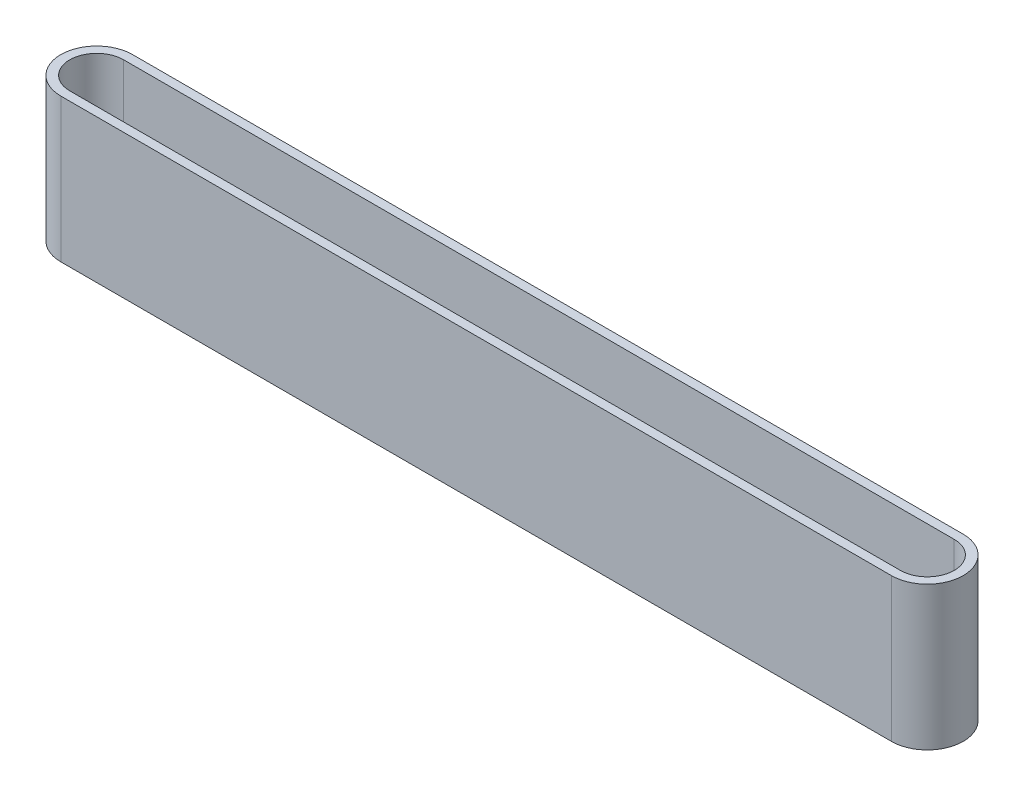
ISO-10303-21;
HEADER;
FILE_DESCRIPTION(('STEP AP214'),'2;1');
FILE_NAME('part.step','',(''),(''),'','','');
FILE_SCHEMA(('AUTOMOTIVE_DESIGN { 1 0 10303 214 1 1 1 1 }'));
ENDSEC;
DATA;
#1=APPLICATION_CONTEXT('core data for automotive mechanical design processes');
#2=APPLICATION_PROTOCOL_DEFINITION('international standard','automotive_design',2000,#1);
#3=PRODUCT_CONTEXT('',#1,'mechanical');
#4=PRODUCT('Part','Part','',(#3));
#5=PRODUCT_RELATED_PRODUCT_CATEGORY('part','',(#4));
#6=PRODUCT_DEFINITION_FORMATION('','',#4);
#7=PRODUCT_DEFINITION_CONTEXT('part definition',#1,'design');
#8=PRODUCT_DEFINITION('design','',#6,#7);
#9=PRODUCT_DEFINITION_SHAPE('','',#8);
#10=(LENGTH_UNIT() NAMED_UNIT(*) SI_UNIT(.MILLI.,.METRE.));
#11=(NAMED_UNIT(*) PLANE_ANGLE_UNIT() SI_UNIT($,.RADIAN.));
#12=(NAMED_UNIT(*) SI_UNIT($,.STERADIAN.) SOLID_ANGLE_UNIT());
#13=UNCERTAINTY_MEASURE_WITH_UNIT(LENGTH_MEASURE(1.E-05),#10,'distance_accuracy_value','');
#14=(GEOMETRIC_REPRESENTATION_CONTEXT(3) GLOBAL_UNCERTAINTY_ASSIGNED_CONTEXT((#13)) GLOBAL_UNIT_ASSIGNED_CONTEXT((#10,
#11,#12)) REPRESENTATION_CONTEXT('',''));
#15=CARTESIAN_POINT('',(0.,0.,0.));
#16=DIRECTION('',(0.,0.,1.));
#17=DIRECTION('',(1.,0.,0.));
#18=AXIS2_PLACEMENT_3D('',#15,#16,#17);
#19=CARTESIAN_POINT('',(-39.547680323748,16.,0.));
#20=DIRECTION('',(0.,1.,0.));
#21=DIRECTION('',(0.,0.,1.));
#22=AXIS2_PLACEMENT_3D('',#19,#20,#21);
#23=PLANE('',#22);
#24=CARTESIAN_POINT('',(-39.547680323748,16.,0.));
#25=DIRECTION('',(0.,1.,0.));
#26=DIRECTION('',(1.,0.,0.));
#27=AXIS2_PLACEMENT_3D('',#24,#25,#26);
#28=CIRCLE('',#27,3.99999999999999);
#29=CARTESIAN_POINT('',(-39.547680323748,16.,-3.99999999999999));
#30=VERTEX_POINT('',#29);
#31=CARTESIAN_POINT('',(-39.547680323748,16.,3.99999999999999));
#32=VERTEX_POINT('',#31);
#33=EDGE_CURVE('E158',#30,#32,#28,.T.);
#34=ORIENTED_EDGE('',*,*,#33,.T.);
#35=DIRECTION('',(1.,0.,0.));
#36=VECTOR('',#35,1.);
#37=CARTESIAN_POINT('',(-39.547680323748,16.,3.99999999999999));
#38=LINE('',#37,#36);
#39=CARTESIAN_POINT('',(53.002319676252,16.,4.));
#40=VERTEX_POINT('',#39);
#41=EDGE_CURVE('E161',#32,#40,#38,.T.);
#42=ORIENTED_EDGE('',*,*,#41,.T.);
#43=CARTESIAN_POINT('',(53.002319676252,16.,0.));
#44=DIRECTION('',(0.,1.,0.));
#45=DIRECTION('',(1.,0.,0.));
#46=AXIS2_PLACEMENT_3D('',#43,#44,#45);
#47=CIRCLE('',#46,4.);
#48=CARTESIAN_POINT('',(53.002319676252,16.,-4.));
#49=VERTEX_POINT('',#48);
#50=EDGE_CURVE('E164',#40,#49,#47,.T.);
#51=ORIENTED_EDGE('',*,*,#50,.T.);
#52=DIRECTION('',(-1.,0.,0.));
#53=VECTOR('',#52,1.);
#54=CARTESIAN_POINT('',(-39.547680323748,16.,-3.99999999999999));
#55=LINE('',#54,#53);
#56=EDGE_CURVE('E166',#49,#30,#55,.T.);
#57=ORIENTED_EDGE('',*,*,#56,.T.);
#58=EDGE_LOOP('',(#34,#42,#51,#57));
#59=FACE_BOUND('',#58,.T.);
#60=DIRECTION('',(1.,0.,0.));
#61=VECTOR('',#60,1.);
#62=CARTESIAN_POINT('',(-39.547680323748,16.,2.99999999999999));
#63=LINE('',#62,#61);
#64=CARTESIAN_POINT('',(-39.547680323748,16.,2.99999999999999));
#65=VERTEX_POINT('',#64);
#66=CARTESIAN_POINT('',(53.002319676252,16.,3.));
#67=VERTEX_POINT('',#66);
#68=EDGE_CURVE('E130',#65,#67,#63,.T.);
#69=ORIENTED_EDGE('',*,*,#68,.F.);
#70=CARTESIAN_POINT('',(-39.547680323748,16.,0.));
#71=DIRECTION('',(0.,1.,0.));
#72=DIRECTION('',(0.,0.,1.));
#73=AXIS2_PLACEMENT_3D('',#70,#71,#72);
#74=CIRCLE('',#73,2.99999999999999);
#75=CARTESIAN_POINT('',(-39.547680323748,16.,-2.99999999999999));
#76=VERTEX_POINT('',#75);
#77=EDGE_CURVE('E122',#76,#65,#74,.T.);
#78=ORIENTED_EDGE('',*,*,#77,.F.);
#79=DIRECTION('',(-1.,0.,0.));
#80=VECTOR('',#79,1.);
#81=CARTESIAN_POINT('',(-39.547680323748,16.,-2.99999999999999));
#82=LINE('',#81,#80);
#83=CARTESIAN_POINT('',(53.002319676252,16.,-3.));
#84=VERTEX_POINT('',#83);
#85=EDGE_CURVE('E144',#84,#76,#82,.T.);
#86=ORIENTED_EDGE('',*,*,#85,.F.);
#87=CARTESIAN_POINT('',(53.002319676252,16.,0.));
#88=DIRECTION('',(0.,1.,0.));
#89=DIRECTION('',(0.,0.,-1.));
#90=AXIS2_PLACEMENT_3D('',#87,#88,#89);
#91=CIRCLE('',#90,3.);
#92=EDGE_CURVE('E142',#67,#84,#91,.T.);
#93=ORIENTED_EDGE('',*,*,#92,.F.);
#94=EDGE_LOOP('',(#69,#78,#86,#93));
#95=FACE_BOUND('',#94,.T.);
#96=ADVANCED_FACE('F57',(#59,#95),#23,.T.);
#97=CARTESIAN_POINT('',(-39.547680323748,0.,0.));
#98=DIRECTION('',(0.,1.,0.));
#99=DIRECTION('',(0.,0.,1.));
#100=AXIS2_PLACEMENT_3D('',#97,#98,#99);
#101=PLANE('',#100);
#102=CARTESIAN_POINT('',(-39.547680323748,0.,0.));
#103=DIRECTION('',(0.,1.,0.));
#104=DIRECTION('',(1.,0.,0.));
#105=AXIS2_PLACEMENT_3D('',#102,#103,#104);
#106=CIRCLE('',#105,3.99999999999999);
#107=CARTESIAN_POINT('',(-39.547680323748,0.,-3.99999999999999));
#108=VERTEX_POINT('',#107);
#109=CARTESIAN_POINT('',(-39.547680323748,0.,3.99999999999999));
#110=VERTEX_POINT('',#109);
#111=EDGE_CURVE('E138',#108,#110,#106,.T.);
#112=ORIENTED_EDGE('',*,*,#111,.F.);
#113=DIRECTION('',(-1.,0.,0.));
#114=VECTOR('',#113,1.);
#115=CARTESIAN_POINT('',(-39.547680323748,0.,-3.99999999999999));
#116=LINE('',#115,#114);
#117=CARTESIAN_POINT('',(53.002319676252,0.,-4.));
#118=VERTEX_POINT('',#117);
#119=EDGE_CURVE('E162',#118,#108,#116,.T.);
#120=ORIENTED_EDGE('',*,*,#119,.F.);
#121=CARTESIAN_POINT('',(53.002319676252,0.,0.));
#122=DIRECTION('',(0.,1.,0.));
#123=DIRECTION('',(1.,0.,0.));
#124=AXIS2_PLACEMENT_3D('',#121,#122,#123);
#125=CIRCLE('',#124,4.);
#126=CARTESIAN_POINT('',(53.002319676252,0.,4.));
#127=VERTEX_POINT('',#126);
#128=EDGE_CURVE('E173',#127,#118,#125,.T.);
#129=ORIENTED_EDGE('',*,*,#128,.F.);
#130=DIRECTION('',(1.,0.,0.));
#131=VECTOR('',#130,1.);
#132=CARTESIAN_POINT('',(-39.547680323748,0.,3.99999999999999));
#133=LINE('',#132,#131);
#134=EDGE_CURVE('E171',#110,#127,#133,.T.);
#135=ORIENTED_EDGE('',*,*,#134,.F.);
#136=EDGE_LOOP('',(#112,#120,#129,#135));
#137=FACE_BOUND('',#136,.T.);
#138=CARTESIAN_POINT('',(-39.547680323748,0.,0.));
#139=DIRECTION('',(0.,1.,0.));
#140=DIRECTION('',(0.,0.,1.));
#141=AXIS2_PLACEMENT_3D('',#138,#139,#140);
#142=CIRCLE('',#141,2.99999999999999);
#143=CARTESIAN_POINT('',(-39.547680323748,0.,-2.99999999999999));
#144=VERTEX_POINT('',#143);
#145=CARTESIAN_POINT('',(-39.547680323748,0.,2.99999999999999));
#146=VERTEX_POINT('',#145);
#147=EDGE_CURVE('E80',#144,#146,#142,.T.);
#148=ORIENTED_EDGE('',*,*,#147,.T.);
#149=DIRECTION('',(1.,0.,0.));
#150=VECTOR('',#149,1.);
#151=CARTESIAN_POINT('',(-39.547680323748,0.,2.99999999999999));
#152=LINE('',#151,#150);
#153=CARTESIAN_POINT('',(53.002319676252,0.,3.));
#154=VERTEX_POINT('',#153);
#155=EDGE_CURVE('E137',#146,#154,#152,.T.);
#156=ORIENTED_EDGE('',*,*,#155,.T.);
#157=CARTESIAN_POINT('',(53.002319676252,0.,0.));
#158=DIRECTION('',(0.,1.,0.));
#159=DIRECTION('',(0.,0.,-1.));
#160=AXIS2_PLACEMENT_3D('',#157,#158,#159);
#161=CIRCLE('',#160,3.);
#162=CARTESIAN_POINT('',(53.002319676252,0.,-3.));
#163=VERTEX_POINT('',#162);
#164=EDGE_CURVE('E150',#154,#163,#161,.T.);
#165=ORIENTED_EDGE('',*,*,#164,.T.);
#166=DIRECTION('',(-1.,0.,0.));
#167=VECTOR('',#166,1.);
#168=CARTESIAN_POINT('',(-39.547680323748,0.,-2.99999999999999));
#169=LINE('',#168,#167);
#170=EDGE_CURVE('E131',#163,#144,#169,.T.);
#171=ORIENTED_EDGE('',*,*,#170,.T.);
#172=EDGE_LOOP('',(#148,#156,#165,#171));
#173=FACE_BOUND('',#172,.T.);
#174=ADVANCED_FACE('F191',(#137,#173),#101,.F.);
#175=CARTESIAN_POINT('',(-39.547680323748,16.,0.));
#176=DIRECTION('',(0.,-1.,0.));
#177=DIRECTION('',(0.,0.,-1.));
#178=AXIS2_PLACEMENT_3D('',#175,#176,#177);
#179=CYLINDRICAL_SURFACE('',#178,3.99999999999999);
#180=ORIENTED_EDGE('',*,*,#111,.T.);
#181=DIRECTION('',(0.,-1.,0.));
#182=VECTOR('',#181,1.);
#183=CARTESIAN_POINT('',(-39.547680323748,16.,3.99999999999999));
#184=LINE('',#183,#182);
#185=EDGE_CURVE('E12',#32,#110,#184,.T.);
#186=ORIENTED_EDGE('',*,*,#185,.F.);
#187=ORIENTED_EDGE('',*,*,#33,.F.);
#188=DIRECTION('',(0.,-1.,0.));
#189=VECTOR('',#188,1.);
#190=CARTESIAN_POINT('',(-39.547680323748,16.,-3.99999999999999));
#191=LINE('',#190,#189);
#192=EDGE_CURVE('E168',#30,#108,#191,.T.);
#193=ORIENTED_EDGE('',*,*,#192,.T.);
#194=EDGE_LOOP('',(#180,#186,#187,#193));
#195=FACE_BOUND('',#194,.T.);
#196=ADVANCED_FACE('F59',(#195),#179,.T.);
#197=CARTESIAN_POINT('',(-39.547680323748,16.,3.99999999999999));
#198=DIRECTION('',(0.,0.,-1.));
#199=DIRECTION('',(-1.,0.,0.));
#200=AXIS2_PLACEMENT_3D('',#197,#198,#199);
#201=PLANE('',#200);
#202=ORIENTED_EDGE('',*,*,#134,.T.);
#203=DIRECTION('',(0.,-1.,0.));
#204=VECTOR('',#203,1.);
#205=CARTESIAN_POINT('',(53.002319676252,16.,4.));
#206=LINE('',#205,#204);
#207=EDGE_CURVE('E65',#40,#127,#206,.T.);
#208=ORIENTED_EDGE('',*,*,#207,.F.);
#209=ORIENTED_EDGE('',*,*,#41,.F.);
#210=ORIENTED_EDGE('',*,*,#185,.T.);
#211=EDGE_LOOP('',(#202,#208,#209,#210));
#212=FACE_BOUND('',#211,.T.);
#213=ADVANCED_FACE('F201',(#212),#201,.F.);
#214=CARTESIAN_POINT('',(53.002319676252,16.,0.));
#215=DIRECTION('',(0.,-1.,0.));
#216=DIRECTION('',(0.,0.,-1.));
#217=AXIS2_PLACEMENT_3D('',#214,#215,#216);
#218=CYLINDRICAL_SURFACE('',#217,4.);
#219=ORIENTED_EDGE('',*,*,#128,.T.);
#220=DIRECTION('',(0.,-1.,0.));
#221=VECTOR('',#220,1.);
#222=CARTESIAN_POINT('',(53.002319676252,16.,-4.));
#223=LINE('',#222,#221);
#224=EDGE_CURVE('E178',#49,#118,#223,.T.);
#225=ORIENTED_EDGE('',*,*,#224,.F.);
#226=ORIENTED_EDGE('',*,*,#50,.F.);
#227=ORIENTED_EDGE('',*,*,#207,.T.);
#228=EDGE_LOOP('',(#219,#225,#226,#227));
#229=FACE_BOUND('',#228,.T.);
#230=ADVANCED_FACE('F185',(#229),#218,.T.);
#231=CARTESIAN_POINT('',(-39.547680323748,16.,-3.99999999999999));
#232=DIRECTION('',(0.,0.,1.));
#233=DIRECTION('',(1.,0.,0.));
#234=AXIS2_PLACEMENT_3D('',#231,#232,#233);
#235=PLANE('',#234);
#236=ORIENTED_EDGE('',*,*,#119,.T.);
#237=ORIENTED_EDGE('',*,*,#192,.F.);
#238=ORIENTED_EDGE('',*,*,#56,.F.);
#239=ORIENTED_EDGE('',*,*,#224,.T.);
#240=EDGE_LOOP('',(#236,#237,#238,#239));
#241=FACE_BOUND('',#240,.T.);
#242=ADVANCED_FACE('F195',(#241),#235,.F.);
#243=CARTESIAN_POINT('',(-39.547680323748,16.,0.));
#244=DIRECTION('',(0.,-1.,0.));
#245=DIRECTION('',(0.,0.,-1.));
#246=AXIS2_PLACEMENT_3D('',#243,#244,#245);
#247=CYLINDRICAL_SURFACE('',#246,2.99999999999999);
#248=ORIENTED_EDGE('',*,*,#147,.F.);
#249=DIRECTION('',(0.,-1.,0.));
#250=VECTOR('',#249,1.);
#251=CARTESIAN_POINT('',(-39.547680323748,16.,-2.99999999999999));
#252=LINE('',#251,#250);
#253=EDGE_CURVE('E126',#76,#144,#252,.T.);
#254=ORIENTED_EDGE('',*,*,#253,.F.);
#255=ORIENTED_EDGE('',*,*,#77,.T.);
#256=DIRECTION('',(0.,-1.,0.));
#257=VECTOR('',#256,1.);
#258=CARTESIAN_POINT('',(-39.547680323748,16.,2.99999999999999));
#259=LINE('',#258,#257);
#260=EDGE_CURVE('E125',#65,#146,#259,.T.);
#261=ORIENTED_EDGE('',*,*,#260,.T.);
#262=EDGE_LOOP('',(#248,#254,#255,#261));
#263=FACE_BOUND('',#262,.T.);
#264=ADVANCED_FACE('F124',(#263),#247,.F.);
#265=CARTESIAN_POINT('',(-39.547680323748,16.,2.99999999999999));
#266=DIRECTION('',(0.,0.,-1.));
#267=DIRECTION('',(-1.,0.,0.));
#268=AXIS2_PLACEMENT_3D('',#265,#266,#267);
#269=PLANE('',#268);
#270=ORIENTED_EDGE('',*,*,#155,.F.);
#271=ORIENTED_EDGE('',*,*,#260,.F.);
#272=ORIENTED_EDGE('',*,*,#68,.T.);
#273=DIRECTION('',(0.,-1.,0.));
#274=VECTOR('',#273,1.);
#275=CARTESIAN_POINT('',(53.002319676252,16.,3.));
#276=LINE('',#275,#274);
#277=EDGE_CURVE('E139',#67,#154,#276,.T.);
#278=ORIENTED_EDGE('',*,*,#277,.T.);
#279=EDGE_LOOP('',(#270,#271,#272,#278));
#280=FACE_BOUND('',#279,.T.);
#281=ADVANCED_FACE('F134',(#280),#269,.T.);
#282=CARTESIAN_POINT('',(53.002319676252,16.,0.));
#283=DIRECTION('',(0.,-1.,0.));
#284=DIRECTION('',(0.,0.,-1.));
#285=AXIS2_PLACEMENT_3D('',#282,#283,#284);
#286=CYLINDRICAL_SURFACE('',#285,3.);
#287=ORIENTED_EDGE('',*,*,#164,.F.);
#288=ORIENTED_EDGE('',*,*,#277,.F.);
#289=ORIENTED_EDGE('',*,*,#92,.T.);
#290=DIRECTION('',(0.,-1.,0.));
#291=VECTOR('',#290,1.);
#292=CARTESIAN_POINT('',(53.002319676252,16.,-3.));
#293=LINE('',#292,#291);
#294=EDGE_CURVE('E72',#84,#163,#293,.T.);
#295=ORIENTED_EDGE('',*,*,#294,.T.);
#296=EDGE_LOOP('',(#287,#288,#289,#295));
#297=FACE_BOUND('',#296,.T.);
#298=ADVANCED_FACE('F224',(#297),#286,.F.);
#299=CARTESIAN_POINT('',(-39.547680323748,16.,-2.99999999999999));
#300=DIRECTION('',(0.,0.,1.));
#301=DIRECTION('',(1.,0.,0.));
#302=AXIS2_PLACEMENT_3D('',#299,#300,#301);
#303=PLANE('',#302);
#304=ORIENTED_EDGE('',*,*,#170,.F.);
#305=ORIENTED_EDGE('',*,*,#294,.F.);
#306=ORIENTED_EDGE('',*,*,#85,.T.);
#307=ORIENTED_EDGE('',*,*,#253,.T.);
#308=EDGE_LOOP('',(#304,#305,#306,#307));
#309=FACE_BOUND('',#308,.T.);
#310=ADVANCED_FACE('F228',(#309),#303,.T.);
#311=CLOSED_SHELL('',(#96,#174,#196,#213,#230,#242,#264,#281,#298,#310));
#312=MANIFOLD_SOLID_BREP('B2',#311);
#313=ADVANCED_BREP_SHAPE_REPRESENTATION('',(#18,#312),#14);
#314=SHAPE_DEFINITION_REPRESENTATION(#9,#313);
ENDSEC;
END-ISO-10303-21;
